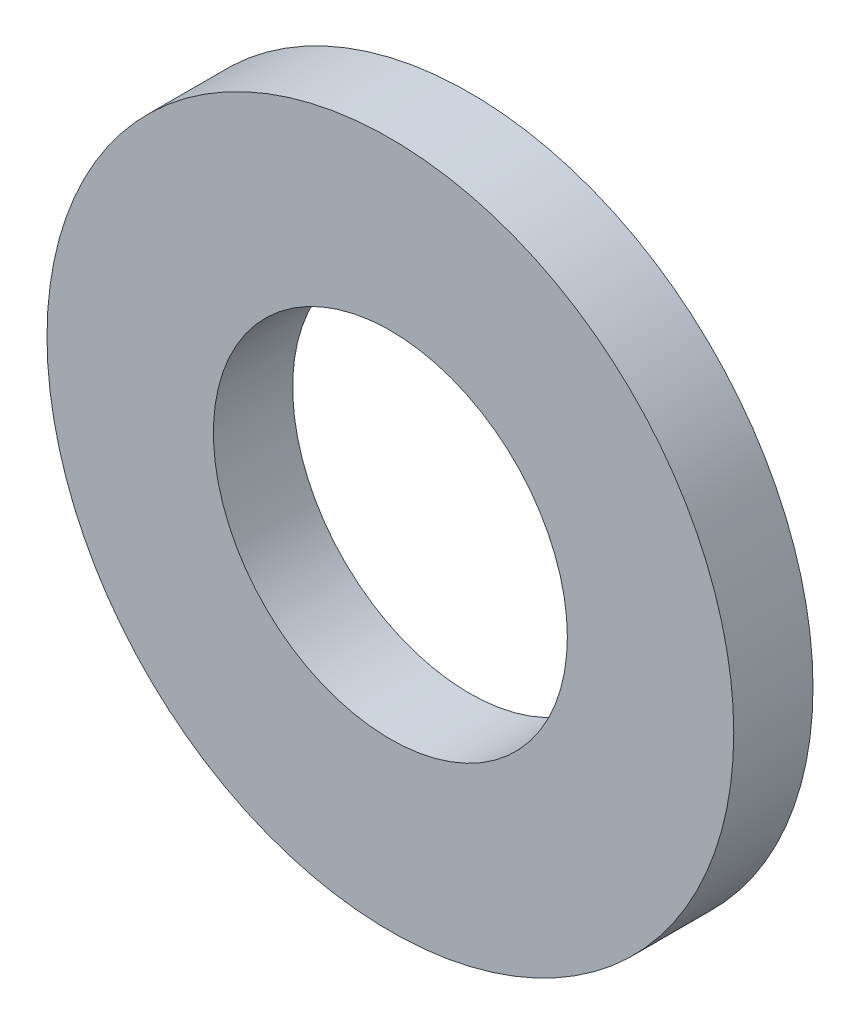
ISO-10303-21;
HEADER;
FILE_DESCRIPTION(('STEP AP214'),'2;1');
FILE_NAME('part.step','',(''),(''),'','','');
FILE_SCHEMA(('AUTOMOTIVE_DESIGN { 1 0 10303 214 1 1 1 1 }'));
ENDSEC;
DATA;
#1=APPLICATION_CONTEXT('core data for automotive mechanical design processes');
#2=APPLICATION_PROTOCOL_DEFINITION('international standard','automotive_design',2000,#1);
#3=PRODUCT_CONTEXT('',#1,'mechanical');
#4=PRODUCT('Part','Part','',(#3));
#5=PRODUCT_RELATED_PRODUCT_CATEGORY('part','',(#4));
#6=PRODUCT_DEFINITION_FORMATION('','',#4);
#7=PRODUCT_DEFINITION_CONTEXT('part definition',#1,'design');
#8=PRODUCT_DEFINITION('design','',#6,#7);
#9=PRODUCT_DEFINITION_SHAPE('','',#8);
#10=(LENGTH_UNIT() NAMED_UNIT(*) SI_UNIT(.MILLI.,.METRE.));
#11=(NAMED_UNIT(*) PLANE_ANGLE_UNIT() SI_UNIT($,.RADIAN.));
#12=(NAMED_UNIT(*) SI_UNIT($,.STERADIAN.) SOLID_ANGLE_UNIT());
#13=UNCERTAINTY_MEASURE_WITH_UNIT(LENGTH_MEASURE(1.E-05),#10,'distance_accuracy_value','');
#14=(GEOMETRIC_REPRESENTATION_CONTEXT(3) GLOBAL_UNCERTAINTY_ASSIGNED_CONTEXT((#13)) GLOBAL_UNIT_ASSIGNED_CONTEXT((#10,
#11,#12)) REPRESENTATION_CONTEXT('',''));
#15=CARTESIAN_POINT('',(0.,0.,0.));
#16=DIRECTION('',(0.,0.,1.));
#17=DIRECTION('',(1.,0.,0.));
#18=AXIS2_PLACEMENT_3D('',#15,#16,#17);
#19=CARTESIAN_POINT('',(0.,6.5,0.));
#20=DIRECTION('',(0.,0.,-1.));
#21=DIRECTION('',(-1.,0.,0.));
#22=AXIS2_PLACEMENT_3D('',#19,#20,#21);
#23=PLANE('',#22);
#24=CARTESIAN_POINT('',(0.,0.,0.));
#25=DIRECTION('',(0.,0.,1.));
#26=DIRECTION('',(1.,0.,0.));
#27=AXIS2_PLACEMENT_3D('',#24,#25,#26);
#28=CIRCLE('',#27,3.35);
#29=CARTESIAN_POINT('',(3.35,0.,0.));
#30=VERTEX_POINT('',#29);
#31=EDGE_CURVE('E8',#30,#30,#28,.T.);
#32=ORIENTED_EDGE('',*,*,#31,.T.);
#33=EDGE_LOOP('',(#32));
#34=FACE_BOUND('',#33,.T.);
#35=CARTESIAN_POINT('',(0.,0.,0.));
#36=DIRECTION('',(0.,0.,1.));
#37=DIRECTION('',(1.,0.,0.));
#38=AXIS2_PLACEMENT_3D('',#35,#36,#37);
#39=CIRCLE('',#38,6.5);
#40=CARTESIAN_POINT('',(6.5,0.,0.));
#41=VERTEX_POINT('',#40);
#42=EDGE_CURVE('E27',#41,#41,#39,.T.);
#43=ORIENTED_EDGE('',*,*,#42,.F.);
#44=EDGE_LOOP('',(#43));
#45=FACE_BOUND('',#44,.T.);
#46=ADVANCED_FACE('F13',(#34,#45),#23,.T.);
#47=CARTESIAN_POINT('',(0.,0.,-60.325));
#48=DIRECTION('',(0.,0.,1.));
#49=DIRECTION('',(1.,0.,0.));
#50=AXIS2_PLACEMENT_3D('',#47,#48,#49);
#51=CYLINDRICAL_SURFACE('',#50,3.35);
#52=CARTESIAN_POINT('',(0.,0.,1.5));
#53=DIRECTION('',(0.,0.,1.));
#54=DIRECTION('',(1.,0.,0.));
#55=AXIS2_PLACEMENT_3D('',#52,#53,#54);
#56=CIRCLE('',#55,3.35);
#57=CARTESIAN_POINT('',(3.35,0.,1.5));
#58=VERTEX_POINT('',#57);
#59=EDGE_CURVE('E19',#58,#58,#56,.T.);
#60=ORIENTED_EDGE('',*,*,#59,.T.);
#61=EDGE_LOOP('',(#60));
#62=FACE_BOUND('',#61,.T.);
#63=ORIENTED_EDGE('',*,*,#31,.F.);
#64=EDGE_LOOP('',(#63));
#65=FACE_BOUND('',#64,.T.);
#66=ADVANCED_FACE('F37',(#62,#65),#51,.F.);
#67=CARTESIAN_POINT('',(0.,3.35,1.5));
#68=DIRECTION('',(0.,0.,1.));
#69=DIRECTION('',(1.,0.,0.));
#70=AXIS2_PLACEMENT_3D('',#67,#68,#69);
#71=PLANE('',#70);
#72=CARTESIAN_POINT('',(0.,0.,1.5));
#73=DIRECTION('',(0.,0.,1.));
#74=DIRECTION('',(1.,0.,0.));
#75=AXIS2_PLACEMENT_3D('',#72,#73,#74);
#76=CIRCLE('',#75,6.5);
#77=CARTESIAN_POINT('',(6.5,0.,1.5));
#78=VERTEX_POINT('',#77);
#79=EDGE_CURVE('E23',#78,#78,#76,.T.);
#80=ORIENTED_EDGE('',*,*,#79,.T.);
#81=EDGE_LOOP('',(#80));
#82=FACE_BOUND('',#81,.T.);
#83=ORIENTED_EDGE('',*,*,#59,.F.);
#84=EDGE_LOOP('',(#83));
#85=FACE_BOUND('',#84,.T.);
#86=ADVANCED_FACE('F42',(#82,#85),#71,.T.);
#87=CARTESIAN_POINT('',(0.,0.,-60.325));
#88=DIRECTION('',(0.,0.,1.));
#89=DIRECTION('',(1.,0.,0.));
#90=AXIS2_PLACEMENT_3D('',#87,#88,#89);
#91=CYLINDRICAL_SURFACE('',#90,6.5);
#92=ORIENTED_EDGE('',*,*,#42,.T.);
#93=EDGE_LOOP('',(#92));
#94=FACE_BOUND('',#93,.T.);
#95=ORIENTED_EDGE('',*,*,#79,.F.);
#96=EDGE_LOOP('',(#95));
#97=FACE_BOUND('',#96,.T.);
#98=ADVANCED_FACE('F33',(#94,#97),#91,.T.);
#99=CLOSED_SHELL('',(#46,#66,#86,#98));
#100=MANIFOLD_SOLID_BREP('B1',#99);
#101=ADVANCED_BREP_SHAPE_REPRESENTATION('',(#18,#100),#14);
#102=SHAPE_DEFINITION_REPRESENTATION(#9,#101);
ENDSEC;
END-ISO-10303-21;
